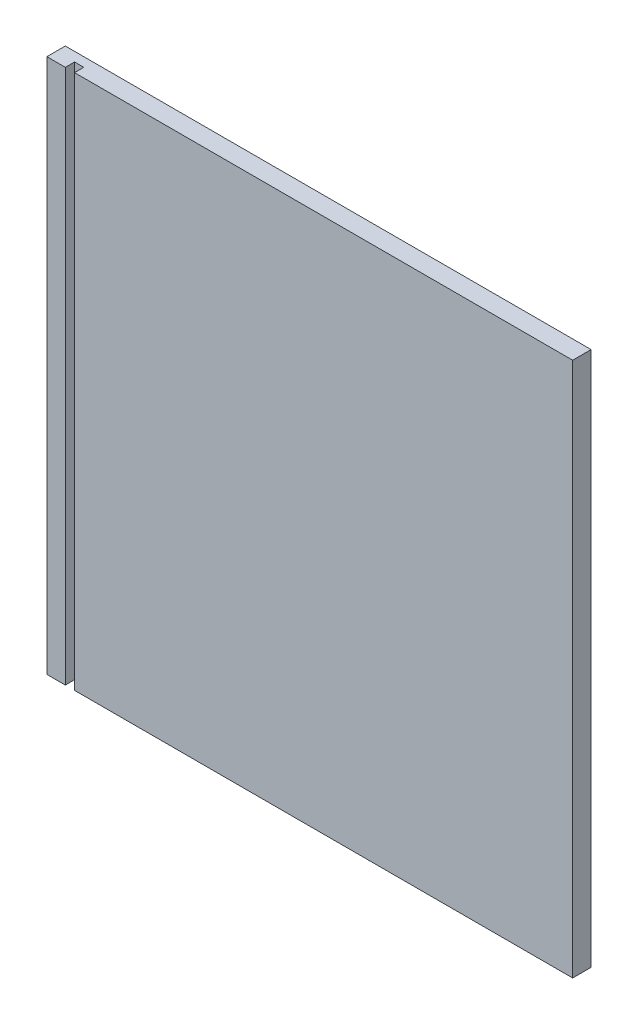
ISO-10303-21;
HEADER;
FILE_DESCRIPTION(('STEP AP214'),'2;1');
FILE_NAME('part.step','',(''),(''),'','','');
FILE_SCHEMA(('AUTOMOTIVE_DESIGN { 1 0 10303 214 1 1 1 1 }'));
ENDSEC;
DATA;
#1=APPLICATION_CONTEXT('core data for automotive mechanical design processes');
#2=APPLICATION_PROTOCOL_DEFINITION('international standard','automotive_design',2000,#1);
#3=PRODUCT_CONTEXT('',#1,'mechanical');
#4=PRODUCT('Part','Part','',(#3));
#5=PRODUCT_RELATED_PRODUCT_CATEGORY('part','',(#4));
#6=PRODUCT_DEFINITION_FORMATION('','',#4);
#7=PRODUCT_DEFINITION_CONTEXT('part definition',#1,'design');
#8=PRODUCT_DEFINITION('design','',#6,#7);
#9=PRODUCT_DEFINITION_SHAPE('','',#8);
#10=(LENGTH_UNIT() NAMED_UNIT(*) SI_UNIT(.MILLI.,.METRE.));
#11=(NAMED_UNIT(*) PLANE_ANGLE_UNIT() SI_UNIT($,.RADIAN.));
#12=(NAMED_UNIT(*) SI_UNIT($,.STERADIAN.) SOLID_ANGLE_UNIT());
#13=UNCERTAINTY_MEASURE_WITH_UNIT(LENGTH_MEASURE(1.E-05),#10,'distance_accuracy_value','');
#14=(GEOMETRIC_REPRESENTATION_CONTEXT(3) GLOBAL_UNCERTAINTY_ASSIGNED_CONTEXT((#13)) GLOBAL_UNIT_ASSIGNED_CONTEXT((#10,
#11,#12)) REPRESENTATION_CONTEXT('',''));
#15=CARTESIAN_POINT('',(0.,0.,0.));
#16=DIRECTION('',(0.,0.,1.));
#17=DIRECTION('',(1.,0.,0.));
#18=AXIS2_PLACEMENT_3D('',#15,#16,#17);
#19=CARTESIAN_POINT('',(0.,0.,10.));
#20=DIRECTION('',(0.,0.,1.));
#21=DIRECTION('',(1.,0.,0.));
#22=AXIS2_PLACEMENT_3D('',#19,#20,#21);
#23=PLANE('',#22);
#24=DIRECTION('',(0.,-1.,0.));
#25=VECTOR('',#24,1.);
#26=CARTESIAN_POINT('',(-275.,290.,10.));
#27=LINE('',#26,#25);
#28=CARTESIAN_POINT('',(-275.,290.,10.));
#29=VERTEX_POINT('',#28);
#30=CARTESIAN_POINT('',(-275.,0.,10.));
#31=VERTEX_POINT('',#30);
#32=EDGE_CURVE('E112',#29,#31,#27,.T.);
#33=ORIENTED_EDGE('',*,*,#32,.F.);
#34=DIRECTION('',(-1.,0.,0.));
#35=VECTOR('',#34,1.);
#36=CARTESIAN_POINT('',(0.,290.,10.));
#37=LINE('',#36,#35);
#38=CARTESIAN_POINT('',(-285.,290.,10.));
#39=VERTEX_POINT('',#38);
#40=EDGE_CURVE('E143',#29,#39,#37,.T.);
#41=ORIENTED_EDGE('',*,*,#40,.T.);
#42=DIRECTION('',(0.,-1.,0.));
#43=VECTOR('',#42,1.);
#44=CARTESIAN_POINT('',(-285.,0.,10.));
#45=LINE('',#44,#43);
#46=CARTESIAN_POINT('',(-285.,0.,10.));
#47=VERTEX_POINT('',#46);
#48=EDGE_CURVE('E145',#39,#47,#45,.T.);
#49=ORIENTED_EDGE('',*,*,#48,.T.);
#50=DIRECTION('',(1.,0.,0.));
#51=VECTOR('',#50,1.);
#52=CARTESIAN_POINT('',(0.,0.,10.));
#53=LINE('',#52,#51);
#54=EDGE_CURVE('E147',#47,#31,#53,.T.);
#55=ORIENTED_EDGE('',*,*,#54,.T.);
#56=EDGE_LOOP('',(#33,#41,#49,#55));
#57=FACE_BOUND('',#56,.T.);
#58=ADVANCED_FACE('F32',(#57),#23,.T.);
#59=CARTESIAN_POINT('',(0.,0.,10.));
#60=DIRECTION('',(-1.,0.,0.));
#61=DIRECTION('',(0.,0.,1.));
#62=AXIS2_PLACEMENT_3D('',#59,#60,#61);
#63=PLANE('',#62);
#64=DIRECTION('',(0.,1.,0.));
#65=VECTOR('',#64,1.);
#66=CARTESIAN_POINT('',(0.,0.,0.));
#67=LINE('',#66,#65);
#68=CARTESIAN_POINT('',(0.,0.,0.));
#69=VERTEX_POINT('',#68);
#70=CARTESIAN_POINT('',(0.,290.,0.));
#71=VERTEX_POINT('',#70);
#72=EDGE_CURVE('E137',#69,#71,#67,.T.);
#73=ORIENTED_EDGE('',*,*,#72,.T.);
#74=DIRECTION('',(0.,0.,-1.));
#75=VECTOR('',#74,1.);
#76=CARTESIAN_POINT('',(0.,290.,10.));
#77=LINE('',#76,#75);
#78=CARTESIAN_POINT('',(0.,290.,10.));
#79=VERTEX_POINT('',#78);
#80=EDGE_CURVE('E11',#79,#71,#77,.T.);
#81=ORIENTED_EDGE('',*,*,#80,.F.);
#82=DIRECTION('',(0.,1.,0.));
#83=VECTOR('',#82,1.);
#84=CARTESIAN_POINT('',(0.,0.,10.));
#85=LINE('',#84,#83);
#86=CARTESIAN_POINT('',(0.,0.,10.));
#87=VERTEX_POINT('',#86);
#88=EDGE_CURVE('E141',#87,#79,#85,.T.);
#89=ORIENTED_EDGE('',*,*,#88,.F.);
#90=DIRECTION('',(0.,0.,-1.));
#91=VECTOR('',#90,1.);
#92=CARTESIAN_POINT('',(0.,0.,10.));
#93=LINE('',#92,#91);
#94=EDGE_CURVE('E149',#87,#69,#93,.T.);
#95=ORIENTED_EDGE('',*,*,#94,.T.);
#96=EDGE_LOOP('',(#73,#81,#89,#95));
#97=FACE_BOUND('',#96,.T.);
#98=ADVANCED_FACE('F34',(#97),#63,.F.);
#99=CARTESIAN_POINT('',(0.,290.,10.));
#100=DIRECTION('',(0.,-1.,0.));
#101=DIRECTION('',(1.,0.,0.));
#102=AXIS2_PLACEMENT_3D('',#99,#100,#101);
#103=PLANE('',#102);
#104=ORIENTED_EDGE('',*,*,#40,.F.);
#105=DIRECTION('',(0.,0.,1.));
#106=VECTOR('',#105,1.);
#107=CARTESIAN_POINT('',(-275.,290.,5.));
#108=LINE('',#107,#106);
#109=CARTESIAN_POINT('',(-275.,290.,5.));
#110=VERTEX_POINT('',#109);
#111=EDGE_CURVE('E135',#110,#29,#108,.T.);
#112=ORIENTED_EDGE('',*,*,#111,.F.);
#113=DIRECTION('',(-1.,0.,0.));
#114=VECTOR('',#113,1.);
#115=CARTESIAN_POINT('',(-275.,290.,5.));
#116=LINE('',#115,#114);
#117=CARTESIAN_POINT('',(-270.,290.,5.));
#118=VERTEX_POINT('',#117);
#119=EDGE_CURVE('E116',#118,#110,#116,.T.);
#120=ORIENTED_EDGE('',*,*,#119,.F.);
#121=DIRECTION('',(0.,0.,1.));
#122=VECTOR('',#121,1.);
#123=CARTESIAN_POINT('',(-270.,290.,5.));
#124=LINE('',#123,#122);
#125=CARTESIAN_POINT('',(-270.,290.,10.));
#126=VERTEX_POINT('',#125);
#127=EDGE_CURVE('E138',#118,#126,#124,.T.);
#128=ORIENTED_EDGE('',*,*,#127,.T.);
#129=EDGE_CURVE('E84',#79,#126,#37,.T.);
#130=ORIENTED_EDGE('',*,*,#129,.F.);
#131=ORIENTED_EDGE('',*,*,#80,.T.);
#132=DIRECTION('',(-1.,0.,0.));
#133=VECTOR('',#132,1.);
#134=CARTESIAN_POINT('',(0.,290.,0.));
#135=LINE('',#134,#133);
#136=CARTESIAN_POINT('',(-285.,290.,0.));
#137=VERTEX_POINT('',#136);
#138=EDGE_CURVE('E152',#71,#137,#135,.T.);
#139=ORIENTED_EDGE('',*,*,#138,.T.);
#140=DIRECTION('',(0.,0.,-1.));
#141=VECTOR('',#140,1.);
#142=CARTESIAN_POINT('',(-285.,290.,10.));
#143=LINE('',#142,#141);
#144=EDGE_CURVE('E40',#39,#137,#143,.T.);
#145=ORIENTED_EDGE('',*,*,#144,.F.);
#146=EDGE_LOOP('',(#104,#112,#120,#128,#130,#131,#139,#145));
#147=FACE_BOUND('',#146,.T.);
#148=ADVANCED_FACE('F175',(#147),#103,.F.);
#149=CARTESIAN_POINT('',(-285.,0.,10.));
#150=DIRECTION('',(1.,0.,0.));
#151=DIRECTION('',(0.,0.,-1.));
#152=AXIS2_PLACEMENT_3D('',#149,#150,#151);
#153=PLANE('',#152);
#154=DIRECTION('',(0.,-1.,0.));
#155=VECTOR('',#154,1.);
#156=CARTESIAN_POINT('',(-285.,0.,0.));
#157=LINE('',#156,#155);
#158=CARTESIAN_POINT('',(-285.,0.,0.));
#159=VERTEX_POINT('',#158);
#160=EDGE_CURVE('E154',#137,#159,#157,.T.);
#161=ORIENTED_EDGE('',*,*,#160,.T.);
#162=DIRECTION('',(0.,0.,-1.));
#163=VECTOR('',#162,1.);
#164=CARTESIAN_POINT('',(-285.,0.,10.));
#165=LINE('',#164,#163);
#166=EDGE_CURVE('E158',#47,#159,#165,.T.);
#167=ORIENTED_EDGE('',*,*,#166,.F.);
#168=ORIENTED_EDGE('',*,*,#48,.F.);
#169=ORIENTED_EDGE('',*,*,#144,.T.);
#170=EDGE_LOOP('',(#161,#167,#168,#169));
#171=FACE_BOUND('',#170,.T.);
#172=ADVANCED_FACE('F164',(#171),#153,.F.);
#173=CARTESIAN_POINT('',(0.,0.,10.));
#174=DIRECTION('',(0.,1.,0.));
#175=DIRECTION('',(-1.,0.,0.));
#176=AXIS2_PLACEMENT_3D('',#173,#174,#175);
#177=PLANE('',#176);
#178=DIRECTION('',(1.,0.,0.));
#179=VECTOR('',#178,1.);
#180=CARTESIAN_POINT('',(-275.,0.,5.));
#181=LINE('',#180,#179);
#182=CARTESIAN_POINT('',(-275.,0.,5.));
#183=VERTEX_POINT('',#182);
#184=CARTESIAN_POINT('',(-270.,0.,5.));
#185=VERTEX_POINT('',#184);
#186=EDGE_CURVE('E122',#183,#185,#181,.T.);
#187=ORIENTED_EDGE('',*,*,#186,.F.);
#188=DIRECTION('',(0.,0.,1.));
#189=VECTOR('',#188,1.);
#190=CARTESIAN_POINT('',(-275.,0.,5.));
#191=LINE('',#190,#189);
#192=EDGE_CURVE('E106',#183,#31,#191,.T.);
#193=ORIENTED_EDGE('',*,*,#192,.T.);
#194=ORIENTED_EDGE('',*,*,#54,.F.);
#195=ORIENTED_EDGE('',*,*,#166,.T.);
#196=DIRECTION('',(1.,0.,0.));
#197=VECTOR('',#196,1.);
#198=CARTESIAN_POINT('',(0.,0.,0.));
#199=LINE('',#198,#197);
#200=EDGE_CURVE('E77',#159,#69,#199,.T.);
#201=ORIENTED_EDGE('',*,*,#200,.T.);
#202=ORIENTED_EDGE('',*,*,#94,.F.);
#203=CARTESIAN_POINT('',(-270.,0.,10.));
#204=VERTEX_POINT('',#203);
#205=EDGE_CURVE('E55',#204,#87,#53,.T.);
#206=ORIENTED_EDGE('',*,*,#205,.F.);
#207=DIRECTION('',(0.,0.,1.));
#208=VECTOR('',#207,1.);
#209=CARTESIAN_POINT('',(-270.,0.,5.));
#210=LINE('',#209,#208);
#211=EDGE_CURVE('E47',#185,#204,#210,.T.);
#212=ORIENTED_EDGE('',*,*,#211,.F.);
#213=EDGE_LOOP('',(#187,#193,#194,#195,#201,#202,#206,#212));
#214=FACE_BOUND('',#213,.T.);
#215=ADVANCED_FACE('F127',(#214),#177,.F.);
#216=DIRECTION('',(0.,1.,0.));
#217=VECTOR('',#216,1.);
#218=CARTESIAN_POINT('',(-270.,290.,10.));
#219=LINE('',#218,#217);
#220=EDGE_CURVE('E125',#204,#126,#219,.T.);
#221=ORIENTED_EDGE('',*,*,#220,.F.);
#222=ORIENTED_EDGE('',*,*,#205,.T.);
#223=ORIENTED_EDGE('',*,*,#88,.T.);
#224=ORIENTED_EDGE('',*,*,#129,.T.);
#225=EDGE_LOOP('',(#221,#222,#223,#224));
#226=FACE_BOUND('',#225,.T.);
#227=ADVANCED_FACE('F173',(#226),#23,.T.);
#228=CARTESIAN_POINT('',(0.,0.,0.));
#229=DIRECTION('',(0.,0.,1.));
#230=DIRECTION('',(1.,0.,0.));
#231=AXIS2_PLACEMENT_3D('',#228,#229,#230);
#232=PLANE('',#231);
#233=ORIENTED_EDGE('',*,*,#72,.F.);
#234=ORIENTED_EDGE('',*,*,#200,.F.);
#235=ORIENTED_EDGE('',*,*,#160,.F.);
#236=ORIENTED_EDGE('',*,*,#138,.F.);
#237=EDGE_LOOP('',(#233,#234,#235,#236));
#238=FACE_BOUND('',#237,.T.);
#239=ADVANCED_FACE('F169',(#238),#232,.F.);
#240=CARTESIAN_POINT('',(-275.,290.,5.));
#241=DIRECTION('',(-1.,0.,0.));
#242=DIRECTION('',(0.,-1.,0.));
#243=AXIS2_PLACEMENT_3D('',#240,#241,#242);
#244=PLANE('',#243);
#245=ORIENTED_EDGE('',*,*,#32,.T.);
#246=ORIENTED_EDGE('',*,*,#192,.F.);
#247=DIRECTION('',(0.,-1.,0.));
#248=VECTOR('',#247,1.);
#249=CARTESIAN_POINT('',(-275.,290.,5.));
#250=LINE('',#249,#248);
#251=EDGE_CURVE('E109',#110,#183,#250,.T.);
#252=ORIENTED_EDGE('',*,*,#251,.F.);
#253=ORIENTED_EDGE('',*,*,#111,.T.);
#254=EDGE_LOOP('',(#245,#246,#252,#253));
#255=FACE_BOUND('',#254,.T.);
#256=ADVANCED_FACE('F108',(#255),#244,.F.);
#257=CARTESIAN_POINT('',(-270.,290.,5.));
#258=DIRECTION('',(1.,0.,0.));
#259=DIRECTION('',(0.,1.,0.));
#260=AXIS2_PLACEMENT_3D('',#257,#258,#259);
#261=PLANE('',#260);
#262=ORIENTED_EDGE('',*,*,#220,.T.);
#263=ORIENTED_EDGE('',*,*,#127,.F.);
#264=DIRECTION('',(0.,1.,0.));
#265=VECTOR('',#264,1.);
#266=CARTESIAN_POINT('',(-270.,290.,5.));
#267=LINE('',#266,#265);
#268=EDGE_CURVE('E128',#185,#118,#267,.T.);
#269=ORIENTED_EDGE('',*,*,#268,.F.);
#270=ORIENTED_EDGE('',*,*,#211,.T.);
#271=EDGE_LOOP('',(#262,#263,#269,#270));
#272=FACE_BOUND('',#271,.T.);
#273=ADVANCED_FACE('F174',(#272),#261,.F.);
#274=CARTESIAN_POINT('',(0.,0.,5.));
#275=DIRECTION('',(0.,0.,1.));
#276=DIRECTION('',(1.,0.,0.));
#277=AXIS2_PLACEMENT_3D('',#274,#275,#276);
#278=PLANE('',#277);
#279=ORIENTED_EDGE('',*,*,#251,.T.);
#280=ORIENTED_EDGE('',*,*,#186,.T.);
#281=ORIENTED_EDGE('',*,*,#268,.T.);
#282=ORIENTED_EDGE('',*,*,#119,.T.);
#283=EDGE_LOOP('',(#279,#280,#281,#282));
#284=FACE_BOUND('',#283,.T.);
#285=ADVANCED_FACE('F120',(#284),#278,.T.);
#286=CLOSED_SHELL('',(#58,#98,#148,#172,#215,#227,#239,#256,#273,#285));
#287=MANIFOLD_SOLID_BREP('B2',#286);
#288=ADVANCED_BREP_SHAPE_REPRESENTATION('',(#18,#287),#14);
#289=SHAPE_DEFINITION_REPRESENTATION(#9,#288);
ENDSEC;
END-ISO-10303-21;
